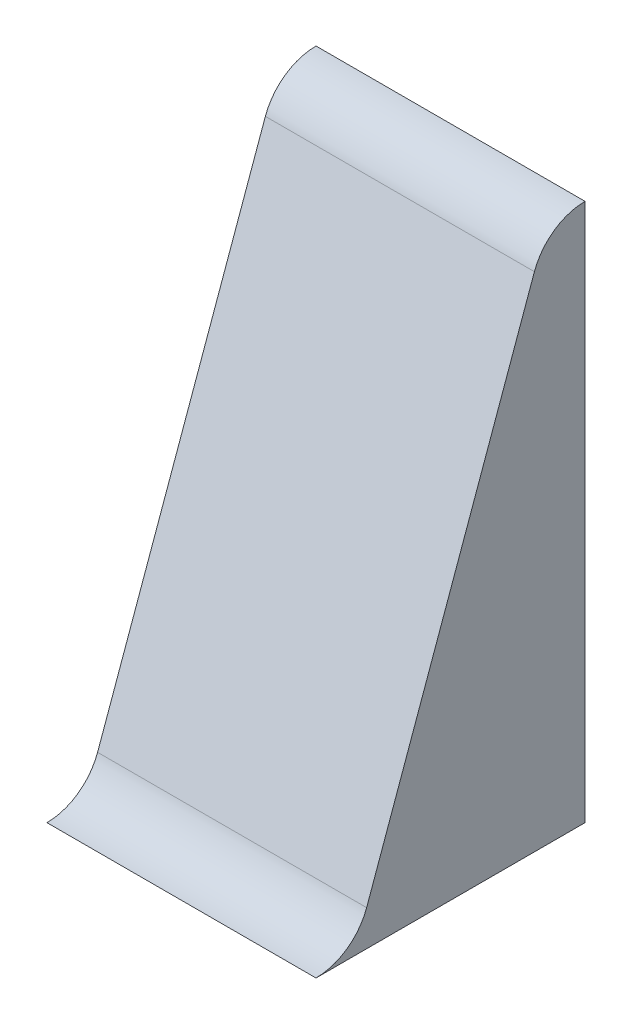
ISO-10303-21;
HEADER;
FILE_DESCRIPTION(('STEP AP214'),'2;1');
FILE_NAME('part.step','',(''),(''),'','','');
FILE_SCHEMA(('AUTOMOTIVE_DESIGN { 1 0 10303 214 1 1 1 1 }'));
ENDSEC;
DATA;
#1=APPLICATION_CONTEXT('core data for automotive mechanical design processes');
#2=APPLICATION_PROTOCOL_DEFINITION('international standard','automotive_design',2000,#1);
#3=PRODUCT_CONTEXT('',#1,'mechanical');
#4=PRODUCT('Part','Part','',(#3));
#5=PRODUCT_RELATED_PRODUCT_CATEGORY('part','',(#4));
#6=PRODUCT_DEFINITION_FORMATION('','',#4);
#7=PRODUCT_DEFINITION_CONTEXT('part definition',#1,'design');
#8=PRODUCT_DEFINITION('design','',#6,#7);
#9=PRODUCT_DEFINITION_SHAPE('','',#8);
#10=(LENGTH_UNIT() NAMED_UNIT(*) SI_UNIT(.MILLI.,.METRE.));
#11=(NAMED_UNIT(*) PLANE_ANGLE_UNIT() SI_UNIT($,.RADIAN.));
#12=(NAMED_UNIT(*) SI_UNIT($,.STERADIAN.) SOLID_ANGLE_UNIT());
#13=UNCERTAINTY_MEASURE_WITH_UNIT(LENGTH_MEASURE(1.E-05),#10,'distance_accuracy_value','');
#14=(GEOMETRIC_REPRESENTATION_CONTEXT(3) GLOBAL_UNCERTAINTY_ASSIGNED_CONTEXT((#13)) GLOBAL_UNIT_ASSIGNED_CONTEXT((#10,
#11,#12)) REPRESENTATION_CONTEXT('',''));
#15=CARTESIAN_POINT('',(0.,0.,0.));
#16=DIRECTION('',(0.,0.,1.));
#17=DIRECTION('',(1.,0.,0.));
#18=AXIS2_PLACEMENT_3D('',#15,#16,#17);
#19=CARTESIAN_POINT('',(1000.,200.,0.));
#20=DIRECTION('',(-1.,0.,0.));
#21=DIRECTION('',(0.,0.,1.));
#22=AXIS2_PLACEMENT_3D('',#19,#20,#21);
#23=CYLINDRICAL_SURFACE('',#22,200.);
#24=CARTESIAN_POINT('',(0.,200.,0.));
#25=DIRECTION('',(-1.,0.,0.));
#26=DIRECTION('',(0.,0.,-1.));
#27=AXIS2_PLACEMENT_3D('',#24,#25,#26);
#28=CIRCLE('',#27,200.);
#29=CARTESIAN_POINT('',(0.,132.364669019181,-188.21652956931));
#30=VERTEX_POINT('',#29);
#31=CARTESIAN_POINT('',(0.,0.,0.));
#32=VERTEX_POINT('',#31);
#33=EDGE_CURVE('E107',#30,#32,#28,.T.);
#34=ORIENTED_EDGE('',*,*,#33,.T.);
#35=DIRECTION('',(-1.,0.,0.));
#36=VECTOR('',#35,1.);
#37=CARTESIAN_POINT('',(1000.,0.,0.));
#38=LINE('',#37,#36);
#39=CARTESIAN_POINT('',(1000.,0.,0.));
#40=VERTEX_POINT('',#39);
#41=EDGE_CURVE('E11',#40,#32,#38,.T.);
#42=ORIENTED_EDGE('',*,*,#41,.F.);
#43=CARTESIAN_POINT('',(1000.,200.,0.));
#44=DIRECTION('',(-1.,0.,0.));
#45=DIRECTION('',(0.,0.,-1.));
#46=AXIS2_PLACEMENT_3D('',#43,#44,#45);
#47=CIRCLE('',#46,200.);
#48=CARTESIAN_POINT('',(1000.,132.364669019181,-188.21652956931));
#49=VERTEX_POINT('',#48);
#50=EDGE_CURVE('E115',#49,#40,#47,.T.);
#51=ORIENTED_EDGE('',*,*,#50,.F.);
#52=DIRECTION('',(-1.,0.,0.));
#53=VECTOR('',#52,1.);
#54=CARTESIAN_POINT('',(1000.,132.364669019181,-188.21652956931));
#55=LINE('',#54,#53);
#56=EDGE_CURVE('E103',#49,#30,#55,.T.);
#57=ORIENTED_EDGE('',*,*,#56,.T.);
#58=EDGE_LOOP('',(#34,#42,#51,#57));
#59=FACE_BOUND('',#58,.T.);
#60=ADVANCED_FACE('F33',(#59),#23,.F.);
#61=CARTESIAN_POINT('',(1000.,0.,0.));
#62=DIRECTION('',(0.,1.,0.));
#63=DIRECTION('',(0.,0.,1.));
#64=AXIS2_PLACEMENT_3D('',#61,#62,#63);
#65=PLANE('',#64);
#66=DIRECTION('',(0.,0.,-1.));
#67=VECTOR('',#66,1.);
#68=CARTESIAN_POINT('',(0.,0.,0.));
#69=LINE('',#68,#67);
#70=CARTESIAN_POINT('',(0.,0.,-1000.));
#71=VERTEX_POINT('',#70);
#72=EDGE_CURVE('E110',#32,#71,#69,.T.);
#73=ORIENTED_EDGE('',*,*,#72,.T.);
#74=DIRECTION('',(-1.,0.,0.));
#75=VECTOR('',#74,1.);
#76=CARTESIAN_POINT('',(1000.,0.,-1000.));
#77=LINE('',#76,#75);
#78=CARTESIAN_POINT('',(1000.,0.,-1000.));
#79=VERTEX_POINT('',#78);
#80=EDGE_CURVE('E41',#79,#71,#77,.T.);
#81=ORIENTED_EDGE('',*,*,#80,.F.);
#82=DIRECTION('',(0.,0.,-1.));
#83=VECTOR('',#82,1.);
#84=CARTESIAN_POINT('',(1000.,0.,0.));
#85=LINE('',#84,#83);
#86=EDGE_CURVE('E83',#40,#79,#85,.T.);
#87=ORIENTED_EDGE('',*,*,#86,.F.);
#88=ORIENTED_EDGE('',*,*,#41,.T.);
#89=EDGE_LOOP('',(#73,#81,#87,#88));
#90=FACE_BOUND('',#89,.T.);
#91=ADVANCED_FACE('F134',(#90),#65,.F.);
#92=CARTESIAN_POINT('',(1000.,0.,-1000.));
#93=DIRECTION('',(0.,0.,1.));
#94=DIRECTION('',(0.,-1.,0.));
#95=AXIS2_PLACEMENT_3D('',#92,#93,#94);
#96=PLANE('',#95);
#97=DIRECTION('',(0.,1.,0.));
#98=VECTOR('',#97,1.);
#99=CARTESIAN_POINT('',(0.,0.,-1000.));
#100=LINE('',#99,#98);
#101=CARTESIAN_POINT('',(0.,2000.,-999.999999999999));
#102=VERTEX_POINT('',#101);
#103=EDGE_CURVE('E98',#71,#102,#100,.T.);
#104=ORIENTED_EDGE('',*,*,#103,.T.);
#105=DIRECTION('',(-1.,0.,0.));
#106=VECTOR('',#105,1.);
#107=CARTESIAN_POINT('',(1000.,2000.,-999.999999999999));
#108=LINE('',#107,#106);
#109=CARTESIAN_POINT('',(1000.,2000.,-999.999999999999));
#110=VERTEX_POINT('',#109);
#111=EDGE_CURVE('E95',#110,#102,#108,.T.);
#112=ORIENTED_EDGE('',*,*,#111,.F.);
#113=DIRECTION('',(0.,1.,0.));
#114=VECTOR('',#113,1.);
#115=CARTESIAN_POINT('',(1000.,0.,-1000.));
#116=LINE('',#115,#114);
#117=EDGE_CURVE('E87',#79,#110,#116,.T.);
#118=ORIENTED_EDGE('',*,*,#117,.F.);
#119=ORIENTED_EDGE('',*,*,#80,.T.);
#120=EDGE_LOOP('',(#104,#112,#118,#119));
#121=FACE_BOUND('',#120,.T.);
#122=ADVANCED_FACE('F96',(#121),#96,.F.);
#123=CARTESIAN_POINT('',(1000.,1800.,-999.999999999999));
#124=DIRECTION('',(-1.,0.,0.));
#125=DIRECTION('',(0.,0.,1.));
#126=AXIS2_PLACEMENT_3D('',#123,#124,#125);
#127=CYLINDRICAL_SURFACE('',#126,200.);
#128=CARTESIAN_POINT('',(0.,1800.,-999.999999999999));
#129=DIRECTION('',(1.,0.,0.));
#130=DIRECTION('',(0.,0.,-1.));
#131=AXIS2_PLACEMENT_3D('',#128,#129,#130);
#132=CIRCLE('',#131,200.);
#133=CARTESIAN_POINT('',(0.,1867.63533098082,-811.783470430689));
#134=VERTEX_POINT('',#133);
#135=EDGE_CURVE('E69',#102,#134,#132,.T.);
#136=ORIENTED_EDGE('',*,*,#135,.T.);
#137=DIRECTION('',(-1.,0.,0.));
#138=VECTOR('',#137,1.);
#139=CARTESIAN_POINT('',(1000.,1867.63533098082,-811.783470430689));
#140=LINE('',#139,#138);
#141=CARTESIAN_POINT('',(1000.,1867.63533098082,-811.783470430689));
#142=VERTEX_POINT('',#141);
#143=EDGE_CURVE('E99',#142,#134,#140,.T.);
#144=ORIENTED_EDGE('',*,*,#143,.F.);
#145=CARTESIAN_POINT('',(1000.,1800.,-999.999999999999));
#146=DIRECTION('',(1.,0.,0.));
#147=DIRECTION('',(0.,0.,-1.));
#148=AXIS2_PLACEMENT_3D('',#145,#146,#147);
#149=CIRCLE('',#148,200.);
#150=EDGE_CURVE('E91',#110,#142,#149,.T.);
#151=ORIENTED_EDGE('',*,*,#150,.F.);
#152=ORIENTED_EDGE('',*,*,#111,.T.);
#153=EDGE_LOOP('',(#136,#144,#151,#152));
#154=FACE_BOUND('',#153,.T.);
#155=ADVANCED_FACE('F101',(#154),#127,.T.);
#156=CARTESIAN_POINT('',(1000.,1867.63533098082,-811.783470430689));
#157=DIRECTION('',(0.,-0.338176654904095,-0.941082647846552));
#158=DIRECTION('',(0.,0.941082647846552,-0.338176654904095));
#159=AXIS2_PLACEMENT_3D('',#156,#157,#158);
#160=PLANE('',#159);
#161=DIRECTION('',(0.,-0.941082647846552,0.338176654904095));
#162=VECTOR('',#161,1.);
#163=CARTESIAN_POINT('',(0.,1867.63533098082,-811.783470430689));
#164=LINE('',#163,#162);
#165=EDGE_CURVE('E75',#134,#30,#164,.T.);
#166=ORIENTED_EDGE('',*,*,#165,.T.);
#167=ORIENTED_EDGE('',*,*,#56,.F.);
#168=DIRECTION('',(0.,-0.941082647846552,0.338176654904095));
#169=VECTOR('',#168,1.);
#170=CARTESIAN_POINT('',(1000.,1867.63533098082,-811.783470430689));
#171=LINE('',#170,#169);
#172=EDGE_CURVE('E49',#142,#49,#171,.T.);
#173=ORIENTED_EDGE('',*,*,#172,.F.);
#174=ORIENTED_EDGE('',*,*,#143,.T.);
#175=EDGE_LOOP('',(#166,#167,#173,#174));
#176=FACE_BOUND('',#175,.T.);
#177=ADVANCED_FACE('F123',(#176),#160,.F.);
#178=CARTESIAN_POINT('',(1000.,200.,0.));
#179=DIRECTION('',(1.,0.,0.));
#180=DIRECTION('',(0.,0.,-1.));
#181=AXIS2_PLACEMENT_3D('',#178,#179,#180);
#182=PLANE('',#181);
#183=ORIENTED_EDGE('',*,*,#50,.T.);
#184=ORIENTED_EDGE('',*,*,#86,.T.);
#185=ORIENTED_EDGE('',*,*,#117,.T.);
#186=ORIENTED_EDGE('',*,*,#150,.T.);
#187=ORIENTED_EDGE('',*,*,#172,.T.);
#188=EDGE_LOOP('',(#183,#184,#185,#186,#187));
#189=FACE_BOUND('',#188,.T.);
#190=ADVANCED_FACE('F89',(#189),#182,.T.);
#191=CARTESIAN_POINT('',(0.,200.,0.));
#192=DIRECTION('',(1.,0.,0.));
#193=DIRECTION('',(0.,0.,-1.));
#194=AXIS2_PLACEMENT_3D('',#191,#192,#193);
#195=PLANE('',#194);
#196=ORIENTED_EDGE('',*,*,#33,.F.);
#197=ORIENTED_EDGE('',*,*,#165,.F.);
#198=ORIENTED_EDGE('',*,*,#135,.F.);
#199=ORIENTED_EDGE('',*,*,#103,.F.);
#200=ORIENTED_EDGE('',*,*,#72,.F.);
#201=EDGE_LOOP('',(#196,#197,#198,#199,#200));
#202=FACE_BOUND('',#201,.T.);
#203=ADVANCED_FACE('F119',(#202),#195,.F.);
#204=CLOSED_SHELL('',(#60,#91,#122,#155,#177,#190,#203));
#205=MANIFOLD_SOLID_BREP('B2',#204);
#206=ADVANCED_BREP_SHAPE_REPRESENTATION('',(#18,#205),#14);
#207=SHAPE_DEFINITION_REPRESENTATION(#9,#206);
ENDSEC;
END-ISO-10303-21;
